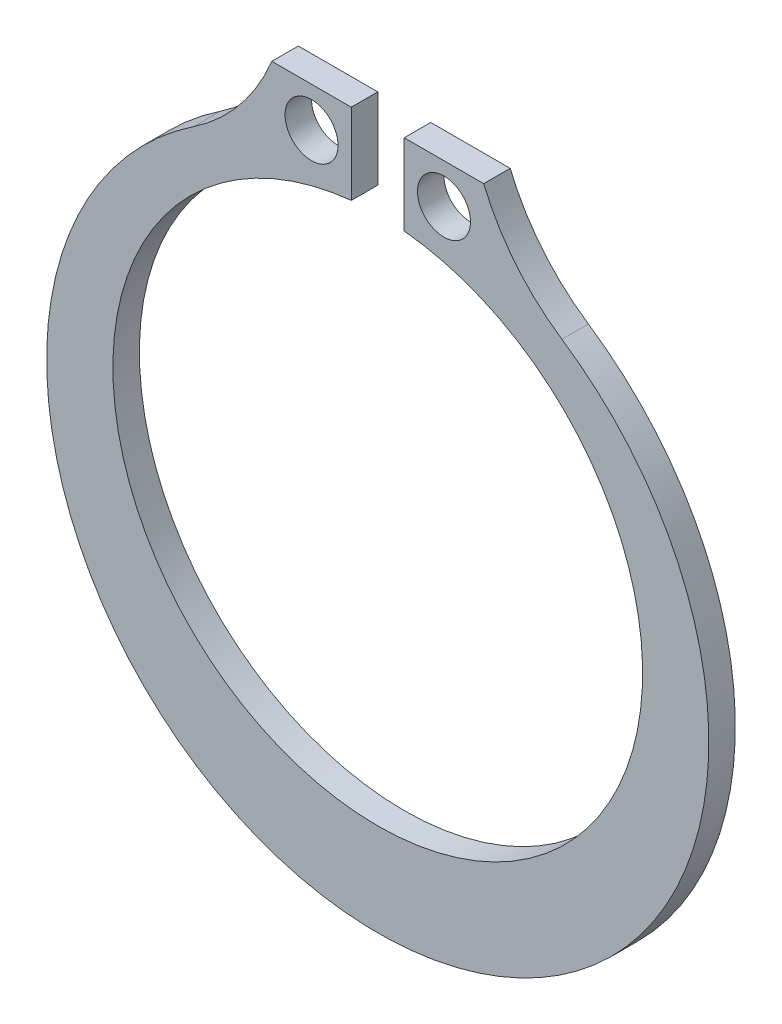
ISO-10303-21;
HEADER;
FILE_DESCRIPTION(('STEP AP214'),'2;1');
FILE_NAME('part.step','',(''),(''),'','','');
FILE_SCHEMA(('AUTOMOTIVE_DESIGN { 1 0 10303 214 1 1 1 1 }'));
ENDSEC;
DATA;
#1=APPLICATION_CONTEXT('core data for automotive mechanical design processes');
#2=APPLICATION_PROTOCOL_DEFINITION('international standard','automotive_design',2000,#1);
#3=PRODUCT_CONTEXT('',#1,'mechanical');
#4=PRODUCT('Part','Part','',(#3));
#5=PRODUCT_RELATED_PRODUCT_CATEGORY('part','',(#4));
#6=PRODUCT_DEFINITION_FORMATION('','',#4);
#7=PRODUCT_DEFINITION_CONTEXT('part definition',#1,'design');
#8=PRODUCT_DEFINITION('design','',#6,#7);
#9=PRODUCT_DEFINITION_SHAPE('','',#8);
#10=(LENGTH_UNIT() NAMED_UNIT(*) SI_UNIT(.MILLI.,.METRE.));
#11=(NAMED_UNIT(*) PLANE_ANGLE_UNIT() SI_UNIT($,.RADIAN.));
#12=(NAMED_UNIT(*) SI_UNIT($,.STERADIAN.) SOLID_ANGLE_UNIT());
#13=UNCERTAINTY_MEASURE_WITH_UNIT(LENGTH_MEASURE(1.E-05),#10,'distance_accuracy_value','');
#14=(GEOMETRIC_REPRESENTATION_CONTEXT(3) GLOBAL_UNCERTAINTY_ASSIGNED_CONTEXT((#13)) GLOBAL_UNIT_ASSIGNED_CONTEXT((#10,
#11,#12)) REPRESENTATION_CONTEXT('',''));
#15=CARTESIAN_POINT('',(0.,0.,0.));
#16=DIRECTION('',(0.,0.,1.));
#17=DIRECTION('',(1.,0.,0.));
#18=AXIS2_PLACEMENT_3D('',#15,#16,#17);
#19=CARTESIAN_POINT('',(-11.4010404379863,17.0372027320039,1.));
#20=DIRECTION('',(0.,0.,-1.));
#21=DIRECTION('',(-1.,0.,0.));
#22=AXIS2_PLACEMENT_3D('',#19,#20,#21);
#23=PLANE('',#22);
#24=CARTESIAN_POINT('',(-11.4010404379863,17.0372027320039,1.));
#25=DIRECTION('',(0.,0.,-1.));
#26=DIRECTION('',(-1.,0.,0.));
#27=AXIS2_PLACEMENT_3D('',#24,#25,#26);
#28=CIRCLE('',#27,8.);
#29=CARTESIAN_POINT('',(-4.,14.,1.));
#30=VERTEX_POINT('',#29);
#31=CARTESIAN_POINT('',(-6.95185392560138,10.3885382512219,1.));
#32=VERTEX_POINT('',#31);
#33=EDGE_CURVE('E146',#30,#32,#28,.T.);
#34=ORIENTED_EDGE('',*,*,#33,.T.);
#35=CARTESIAN_POINT('',(0.,0.,1.));
#36=DIRECTION('',(0.,0.,1.));
#37=DIRECTION('',(1.,0.,0.));
#38=AXIS2_PLACEMENT_3D('',#35,#36,#37);
#39=CIRCLE('',#38,12.5);
#40=CARTESIAN_POINT('',(6.95185392560138,10.3885382512219,1.));
#41=VERTEX_POINT('',#40);
#42=EDGE_CURVE('E100',#32,#41,#39,.T.);
#43=ORIENTED_EDGE('',*,*,#42,.T.);
#44=CARTESIAN_POINT('',(11.4010404379863,17.0372027320039,1.));
#45=DIRECTION('',(0.,0.,-1.));
#46=DIRECTION('',(1.,0.,0.));
#47=AXIS2_PLACEMENT_3D('',#44,#45,#46);
#48=CIRCLE('',#47,7.99999999999999);
#49=CARTESIAN_POINT('',(4.,14.,1.));
#50=VERTEX_POINT('',#49);
#51=EDGE_CURVE('E163',#41,#50,#48,.T.);
#52=ORIENTED_EDGE('',*,*,#51,.T.);
#53=DIRECTION('',(-1.,0.,0.));
#54=VECTOR('',#53,1.);
#55=CARTESIAN_POINT('',(4.,14.,1.));
#56=LINE('',#55,#54);
#57=CARTESIAN_POINT('',(1.,14.,1.));
#58=VERTEX_POINT('',#57);
#59=EDGE_CURVE('E180',#50,#58,#56,.T.);
#60=ORIENTED_EDGE('',*,*,#59,.T.);
#61=DIRECTION('',(0.,-1.,0.));
#62=VECTOR('',#61,1.);
#63=CARTESIAN_POINT('',(1.,14.,1.));
#64=LINE('',#63,#62);
#65=CARTESIAN_POINT('',(1.,10.9498743710662,1.));
#66=VERTEX_POINT('',#65);
#67=EDGE_CURVE('E116',#58,#66,#64,.T.);
#68=ORIENTED_EDGE('',*,*,#67,.T.);
#69=CARTESIAN_POINT('',(0.,1.,1.));
#70=DIRECTION('',(0.,0.,-1.));
#71=DIRECTION('',(1.,0.,0.));
#72=AXIS2_PLACEMENT_3D('',#69,#70,#71);
#73=CIRCLE('',#72,10.);
#74=CARTESIAN_POINT('',(-1.,10.9498743710662,1.));
#75=VERTEX_POINT('',#74);
#76=EDGE_CURVE('E110',#66,#75,#73,.T.);
#77=ORIENTED_EDGE('',*,*,#76,.T.);
#78=DIRECTION('',(0.,1.,0.));
#79=VECTOR('',#78,1.);
#80=CARTESIAN_POINT('',(-1.,14.,1.));
#81=LINE('',#80,#79);
#82=CARTESIAN_POINT('',(-1.,14.,1.));
#83=VERTEX_POINT('',#82);
#84=EDGE_CURVE('E114',#75,#83,#81,.T.);
#85=ORIENTED_EDGE('',*,*,#84,.T.);
#86=DIRECTION('',(-1.,0.,0.));
#87=VECTOR('',#86,1.);
#88=CARTESIAN_POINT('',(-4.,14.,1.));
#89=LINE('',#88,#87);
#90=EDGE_CURVE('E53',#83,#30,#89,.T.);
#91=ORIENTED_EDGE('',*,*,#90,.T.);
#92=EDGE_LOOP('',(#34,#43,#52,#60,#68,#77,#85,#91));
#93=FACE_BOUND('',#92,.T.);
#94=CARTESIAN_POINT('',(-2.5,12.5,1.));
#95=DIRECTION('',(0.,0.,1.));
#96=DIRECTION('',(1.,0.,0.));
#97=AXIS2_PLACEMENT_3D('',#94,#95,#96);
#98=CIRCLE('',#97,1.);
#99=CARTESIAN_POINT('',(-1.5,12.5,1.));
#100=VERTEX_POINT('',#99);
#101=EDGE_CURVE('E138',#100,#100,#98,.T.);
#102=ORIENTED_EDGE('',*,*,#101,.F.);
#103=EDGE_LOOP('',(#102));
#104=FACE_BOUND('',#103,.T.);
#105=CARTESIAN_POINT('',(2.5,12.5,1.));
#106=DIRECTION('',(0.,0.,1.));
#107=DIRECTION('',(-1.,0.,0.));
#108=AXIS2_PLACEMENT_3D('',#105,#106,#107);
#109=CIRCLE('',#108,1.);
#110=CARTESIAN_POINT('',(1.5,12.5,1.));
#111=VERTEX_POINT('',#110);
#112=EDGE_CURVE('E186',#111,#111,#109,.T.);
#113=ORIENTED_EDGE('',*,*,#112,.F.);
#114=EDGE_LOOP('',(#113));
#115=FACE_BOUND('',#114,.T.);
#116=ADVANCED_FACE('F40',(#93,#104,#115),#23,.F.);
#117=CARTESIAN_POINT('',(-11.4010404379863,17.0372027320039,0.));
#118=DIRECTION('',(0.,0.,-1.));
#119=DIRECTION('',(-1.,0.,0.));
#120=AXIS2_PLACEMENT_3D('',#117,#118,#119);
#121=PLANE('',#120);
#122=CARTESIAN_POINT('',(-2.5,12.5,0.));
#123=DIRECTION('',(0.,0.,1.));
#124=DIRECTION('',(1.,0.,0.));
#125=AXIS2_PLACEMENT_3D('',#122,#123,#124);
#126=CIRCLE('',#125,1.);
#127=CARTESIAN_POINT('',(-1.5,12.5,0.));
#128=VERTEX_POINT('',#127);
#129=EDGE_CURVE('E183',#128,#128,#126,.T.);
#130=ORIENTED_EDGE('',*,*,#129,.T.);
#131=EDGE_LOOP('',(#130));
#132=FACE_BOUND('',#131,.T.);
#133=CARTESIAN_POINT('',(-11.4010404379863,17.0372027320039,0.));
#134=DIRECTION('',(0.,0.,-1.));
#135=DIRECTION('',(-1.,0.,0.));
#136=AXIS2_PLACEMENT_3D('',#133,#134,#135);
#137=CIRCLE('',#136,8.);
#138=CARTESIAN_POINT('',(-4.,14.,0.));
#139=VERTEX_POINT('',#138);
#140=CARTESIAN_POINT('',(-6.95185392560138,10.3885382512219,0.));
#141=VERTEX_POINT('',#140);
#142=EDGE_CURVE('E132',#139,#141,#137,.T.);
#143=ORIENTED_EDGE('',*,*,#142,.F.);
#144=DIRECTION('',(-1.,0.,0.));
#145=VECTOR('',#144,1.);
#146=CARTESIAN_POINT('',(-4.,14.,0.));
#147=LINE('',#146,#145);
#148=CARTESIAN_POINT('',(-1.,14.,0.));
#149=VERTEX_POINT('',#148);
#150=EDGE_CURVE('E87',#149,#139,#147,.T.);
#151=ORIENTED_EDGE('',*,*,#150,.F.);
#152=DIRECTION('',(0.,1.,0.));
#153=VECTOR('',#152,1.);
#154=CARTESIAN_POINT('',(-1.,14.,0.));
#155=LINE('',#154,#153);
#156=CARTESIAN_POINT('',(-1.,10.9498743710662,0.));
#157=VERTEX_POINT('',#156);
#158=EDGE_CURVE('E81',#157,#149,#155,.T.);
#159=ORIENTED_EDGE('',*,*,#158,.F.);
#160=CARTESIAN_POINT('',(0.,1.,0.));
#161=DIRECTION('',(0.,0.,-1.));
#162=DIRECTION('',(1.,0.,0.));
#163=AXIS2_PLACEMENT_3D('',#160,#161,#162);
#164=CIRCLE('',#163,10.);
#165=CARTESIAN_POINT('',(1.,10.9498743710662,0.));
#166=VERTEX_POINT('',#165);
#167=EDGE_CURVE('E125',#166,#157,#164,.T.);
#168=ORIENTED_EDGE('',*,*,#167,.F.);
#169=DIRECTION('',(0.,-1.,0.));
#170=VECTOR('',#169,1.);
#171=CARTESIAN_POINT('',(1.,14.,0.));
#172=LINE('',#171,#170);
#173=CARTESIAN_POINT('',(1.,14.,0.));
#174=VERTEX_POINT('',#173);
#175=EDGE_CURVE('E143',#174,#166,#172,.T.);
#176=ORIENTED_EDGE('',*,*,#175,.F.);
#177=DIRECTION('',(-1.,0.,0.));
#178=VECTOR('',#177,1.);
#179=CARTESIAN_POINT('',(4.,14.,0.));
#180=LINE('',#179,#178);
#181=CARTESIAN_POINT('',(4.,14.,0.));
#182=VERTEX_POINT('',#181);
#183=EDGE_CURVE('E145',#182,#174,#180,.T.);
#184=ORIENTED_EDGE('',*,*,#183,.F.);
#185=CARTESIAN_POINT('',(11.4010404379863,17.0372027320039,0.));
#186=DIRECTION('',(0.,0.,-1.));
#187=DIRECTION('',(1.,0.,0.));
#188=AXIS2_PLACEMENT_3D('',#185,#186,#187);
#189=CIRCLE('',#188,7.99999999999999);
#190=CARTESIAN_POINT('',(6.95185392560138,10.3885382512219,0.));
#191=VERTEX_POINT('',#190);
#192=EDGE_CURVE('E139',#191,#182,#189,.T.);
#193=ORIENTED_EDGE('',*,*,#192,.F.);
#194=CARTESIAN_POINT('',(0.,0.,0.));
#195=DIRECTION('',(0.,0.,1.));
#196=DIRECTION('',(1.,0.,0.));
#197=AXIS2_PLACEMENT_3D('',#194,#195,#196);
#198=CIRCLE('',#197,12.5);
#199=EDGE_CURVE('E140',#141,#191,#198,.T.);
#200=ORIENTED_EDGE('',*,*,#199,.F.);
#201=EDGE_LOOP('',(#143,#151,#159,#168,#176,#184,#193,#200));
#202=FACE_BOUND('',#201,.T.);
#203=CARTESIAN_POINT('',(2.5,12.5,0.));
#204=DIRECTION('',(0.,0.,1.));
#205=DIRECTION('',(-1.,0.,0.));
#206=AXIS2_PLACEMENT_3D('',#203,#204,#205);
#207=CIRCLE('',#206,1.);
#208=CARTESIAN_POINT('',(1.5,12.5,0.));
#209=VERTEX_POINT('',#208);
#210=EDGE_CURVE('E188',#209,#209,#207,.T.);
#211=ORIENTED_EDGE('',*,*,#210,.T.);
#212=EDGE_LOOP('',(#211));
#213=FACE_BOUND('',#212,.T.);
#214=ADVANCED_FACE('F166',(#132,#202,#213),#121,.T.);
#215=CARTESIAN_POINT('',(-11.4010404379863,17.0372027320039,1.));
#216=DIRECTION('',(0.,0.,-1.));
#217=DIRECTION('',(-1.,0.,0.));
#218=AXIS2_PLACEMENT_3D('',#215,#216,#217);
#219=CYLINDRICAL_SURFACE('',#218,8.);
#220=ORIENTED_EDGE('',*,*,#142,.T.);
#221=DIRECTION('',(0.,0.,-1.));
#222=VECTOR('',#221,1.);
#223=CARTESIAN_POINT('',(-6.95185392560138,10.3885382512219,1.));
#224=LINE('',#223,#222);
#225=EDGE_CURVE('E11',#32,#141,#224,.T.);
#226=ORIENTED_EDGE('',*,*,#225,.F.);
#227=ORIENTED_EDGE('',*,*,#33,.F.);
#228=DIRECTION('',(0.,0.,-1.));
#229=VECTOR('',#228,1.);
#230=CARTESIAN_POINT('',(-4.,14.,1.));
#231=LINE('',#230,#229);
#232=EDGE_CURVE('E127',#30,#139,#231,.T.);
#233=ORIENTED_EDGE('',*,*,#232,.T.);
#234=EDGE_LOOP('',(#220,#226,#227,#233));
#235=FACE_BOUND('',#234,.T.);
#236=ADVANCED_FACE('F39',(#235),#219,.F.);
#237=CARTESIAN_POINT('',(0.,0.,1.));
#238=DIRECTION('',(0.,0.,-1.));
#239=DIRECTION('',(-1.,0.,0.));
#240=AXIS2_PLACEMENT_3D('',#237,#238,#239);
#241=CYLINDRICAL_SURFACE('',#240,12.5);
#242=ORIENTED_EDGE('',*,*,#199,.T.);
#243=DIRECTION('',(0.,0.,-1.));
#244=VECTOR('',#243,1.);
#245=CARTESIAN_POINT('',(6.95185392560138,10.3885382512219,1.));
#246=LINE('',#245,#244);
#247=EDGE_CURVE('E46',#41,#191,#246,.T.);
#248=ORIENTED_EDGE('',*,*,#247,.F.);
#249=ORIENTED_EDGE('',*,*,#42,.F.);
#250=ORIENTED_EDGE('',*,*,#225,.T.);
#251=EDGE_LOOP('',(#242,#248,#249,#250));
#252=FACE_BOUND('',#251,.T.);
#253=ADVANCED_FACE('F221',(#252),#241,.T.);
#254=CARTESIAN_POINT('',(11.4010404379863,17.0372027320039,1.));
#255=DIRECTION('',(0.,0.,-1.));
#256=DIRECTION('',(-1.,0.,0.));
#257=AXIS2_PLACEMENT_3D('',#254,#255,#256);
#258=CYLINDRICAL_SURFACE('',#257,7.99999999999999);
#259=ORIENTED_EDGE('',*,*,#192,.T.);
#260=DIRECTION('',(0.,0.,-1.));
#261=VECTOR('',#260,1.);
#262=CARTESIAN_POINT('',(4.,14.,1.));
#263=LINE('',#262,#261);
#264=EDGE_CURVE('E157',#50,#182,#263,.T.);
#265=ORIENTED_EDGE('',*,*,#264,.F.);
#266=ORIENTED_EDGE('',*,*,#51,.F.);
#267=ORIENTED_EDGE('',*,*,#247,.T.);
#268=EDGE_LOOP('',(#259,#265,#266,#267));
#269=FACE_BOUND('',#268,.T.);
#270=ADVANCED_FACE('F162',(#269),#258,.F.);
#271=CARTESIAN_POINT('',(4.,14.,1.));
#272=DIRECTION('',(0.,-1.,0.));
#273=DIRECTION('',(0.,0.,-1.));
#274=AXIS2_PLACEMENT_3D('',#271,#272,#273);
#275=PLANE('',#274);
#276=ORIENTED_EDGE('',*,*,#183,.T.);
#277=DIRECTION('',(0.,0.,-1.));
#278=VECTOR('',#277,1.);
#279=CARTESIAN_POINT('',(1.,14.,1.));
#280=LINE('',#279,#278);
#281=EDGE_CURVE('E154',#58,#174,#280,.T.);
#282=ORIENTED_EDGE('',*,*,#281,.F.);
#283=ORIENTED_EDGE('',*,*,#59,.F.);
#284=ORIENTED_EDGE('',*,*,#264,.T.);
#285=EDGE_LOOP('',(#276,#282,#283,#284));
#286=FACE_BOUND('',#285,.T.);
#287=ADVANCED_FACE('F171',(#286),#275,.F.);
#288=CARTESIAN_POINT('',(1.,14.,1.));
#289=DIRECTION('',(1.,0.,0.));
#290=DIRECTION('',(0.,1.,0.));
#291=AXIS2_PLACEMENT_3D('',#288,#289,#290);
#292=PLANE('',#291);
#293=ORIENTED_EDGE('',*,*,#175,.T.);
#294=DIRECTION('',(0.,0.,-1.));
#295=VECTOR('',#294,1.);
#296=CARTESIAN_POINT('',(1.,10.9498743710662,1.));
#297=LINE('',#296,#295);
#298=EDGE_CURVE('E124',#66,#166,#297,.T.);
#299=ORIENTED_EDGE('',*,*,#298,.F.);
#300=ORIENTED_EDGE('',*,*,#67,.F.);
#301=ORIENTED_EDGE('',*,*,#281,.T.);
#302=EDGE_LOOP('',(#293,#299,#300,#301));
#303=FACE_BOUND('',#302,.T.);
#304=ADVANCED_FACE('F176',(#303),#292,.F.);
#305=CARTESIAN_POINT('',(0.,1.,1.));
#306=DIRECTION('',(0.,0.,-1.));
#307=DIRECTION('',(-1.,0.,0.));
#308=AXIS2_PLACEMENT_3D('',#305,#306,#307);
#309=CYLINDRICAL_SURFACE('',#308,10.);
#310=ORIENTED_EDGE('',*,*,#167,.T.);
#311=DIRECTION('',(0.,0.,-1.));
#312=VECTOR('',#311,1.);
#313=CARTESIAN_POINT('',(-1.,10.9498743710662,1.));
#314=LINE('',#313,#312);
#315=EDGE_CURVE('E123',#75,#157,#314,.T.);
#316=ORIENTED_EDGE('',*,*,#315,.F.);
#317=ORIENTED_EDGE('',*,*,#76,.F.);
#318=ORIENTED_EDGE('',*,*,#298,.T.);
#319=EDGE_LOOP('',(#310,#316,#317,#318));
#320=FACE_BOUND('',#319,.T.);
#321=ADVANCED_FACE('F122',(#320),#309,.F.);
#322=CARTESIAN_POINT('',(-1.,14.,1.));
#323=DIRECTION('',(-1.,0.,0.));
#324=DIRECTION('',(0.,-1.,0.));
#325=AXIS2_PLACEMENT_3D('',#322,#323,#324);
#326=PLANE('',#325);
#327=ORIENTED_EDGE('',*,*,#158,.T.);
#328=DIRECTION('',(0.,0.,-1.));
#329=VECTOR('',#328,1.);
#330=CARTESIAN_POINT('',(-1.,14.,1.));
#331=LINE('',#330,#329);
#332=EDGE_CURVE('E128',#83,#149,#331,.T.);
#333=ORIENTED_EDGE('',*,*,#332,.F.);
#334=ORIENTED_EDGE('',*,*,#84,.F.);
#335=ORIENTED_EDGE('',*,*,#315,.T.);
#336=EDGE_LOOP('',(#327,#333,#334,#335));
#337=FACE_BOUND('',#336,.T.);
#338=ADVANCED_FACE('F126',(#337),#326,.F.);
#339=CARTESIAN_POINT('',(-4.,14.,1.));
#340=DIRECTION('',(0.,-1.,0.));
#341=DIRECTION('',(0.,0.,-1.));
#342=AXIS2_PLACEMENT_3D('',#339,#340,#341);
#343=PLANE('',#342);
#344=ORIENTED_EDGE('',*,*,#150,.T.);
#345=ORIENTED_EDGE('',*,*,#232,.F.);
#346=ORIENTED_EDGE('',*,*,#90,.F.);
#347=ORIENTED_EDGE('',*,*,#332,.T.);
#348=EDGE_LOOP('',(#344,#345,#346,#347));
#349=FACE_BOUND('',#348,.T.);
#350=ADVANCED_FACE('F208',(#349),#343,.F.);
#351=CARTESIAN_POINT('',(-2.5,12.5,1.));
#352=DIRECTION('',(0.,0.,-1.));
#353=DIRECTION('',(-1.,0.,0.));
#354=AXIS2_PLACEMENT_3D('',#351,#352,#353);
#355=CYLINDRICAL_SURFACE('',#354,1.);
#356=ORIENTED_EDGE('',*,*,#101,.T.);
#357=EDGE_LOOP('',(#356));
#358=FACE_BOUND('',#357,.T.);
#359=ORIENTED_EDGE('',*,*,#129,.F.);
#360=EDGE_LOOP('',(#359));
#361=FACE_BOUND('',#360,.T.);
#362=ADVANCED_FACE('F206',(#358,#361),#355,.F.);
#363=CARTESIAN_POINT('',(2.5,12.5,1.));
#364=DIRECTION('',(0.,0.,-1.));
#365=DIRECTION('',(-1.,0.,0.));
#366=AXIS2_PLACEMENT_3D('',#363,#364,#365);
#367=CYLINDRICAL_SURFACE('',#366,1.);
#368=ORIENTED_EDGE('',*,*,#112,.T.);
#369=EDGE_LOOP('',(#368));
#370=FACE_BOUND('',#369,.T.);
#371=ORIENTED_EDGE('',*,*,#210,.F.);
#372=EDGE_LOOP('',(#371));
#373=FACE_BOUND('',#372,.T.);
#374=ADVANCED_FACE('F193',(#370,#373),#367,.F.);
#375=CLOSED_SHELL('',(#116,#214,#236,#253,#270,#287,#304,#321,#338,#350,#362,#374));
#376=MANIFOLD_SOLID_BREP('B2',#375);
#377=ADVANCED_BREP_SHAPE_REPRESENTATION('',(#18,#376),#14);
#378=SHAPE_DEFINITION_REPRESENTATION(#9,#377);
ENDSEC;
END-ISO-10303-21;
